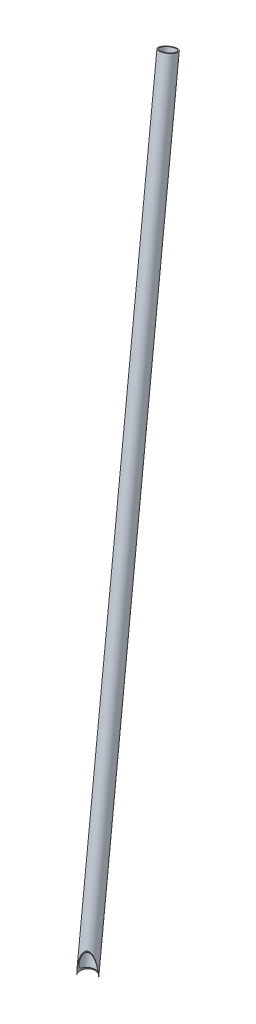
ISO-10303-21;
HEADER;
FILE_DESCRIPTION(('STEP AP214'),'2;1');
FILE_NAME('part.step','',(''),(''),'','','');
FILE_SCHEMA(('AUTOMOTIVE_DESIGN { 1 0 10303 214 1 1 1 1 }'));
ENDSEC;
DATA;
#1=APPLICATION_CONTEXT('core data for automotive mechanical design processes');
#2=APPLICATION_PROTOCOL_DEFINITION('international standard','automotive_design',2000,#1);
#3=PRODUCT_CONTEXT('',#1,'mechanical');
#4=PRODUCT('Part','Part','',(#3));
#5=PRODUCT_RELATED_PRODUCT_CATEGORY('part','',(#4));
#6=PRODUCT_DEFINITION_FORMATION('','',#4);
#7=PRODUCT_DEFINITION_CONTEXT('part definition',#1,'design');
#8=PRODUCT_DEFINITION('design','',#6,#7);
#9=PRODUCT_DEFINITION_SHAPE('','',#8);
#10=(LENGTH_UNIT() NAMED_UNIT(*) SI_UNIT(.MILLI.,.METRE.));
#11=(NAMED_UNIT(*) PLANE_ANGLE_UNIT() SI_UNIT($,.RADIAN.));
#12=(NAMED_UNIT(*) SI_UNIT($,.STERADIAN.) SOLID_ANGLE_UNIT());
#13=UNCERTAINTY_MEASURE_WITH_UNIT(LENGTH_MEASURE(1.E-05),#10,'distance_accuracy_value','');
#14=(GEOMETRIC_REPRESENTATION_CONTEXT(3) GLOBAL_UNCERTAINTY_ASSIGNED_CONTEXT((#13)) GLOBAL_UNIT_ASSIGNED_CONTEXT((#10,
#11,#12)) REPRESENTATION_CONTEXT('',''));
#15=CARTESIAN_POINT('',(0.,0.,0.));
#16=DIRECTION('',(0.,0.,1.));
#17=DIRECTION('',(1.,0.,0.));
#18=AXIS2_PLACEMENT_3D('',#15,#16,#17);
#19=CARTESIAN_POINT('',(250.,1.11022302462516E-13,-1700.));
#20=DIRECTION('',(-0.140336447675245,0.956366902675742,-0.256257739239816));
#21=DIRECTION('',(0.,0.258819045102517,0.965925826289069));
#22=AXIS2_PLACEMENT_3D('',#19,#20,#21);
#23=CYLINDRICAL_SURFACE('',#22,9.39999999999998);
#24=CARTESIAN_POINT('',(115.,920.,-1946.51325703663));
#25=DIRECTION('',(-0.140336447675245,0.956366902675742,-0.256257739239816));
#26=DIRECTION('',(0.,0.258819045102518,0.965925826289069));
#27=AXIS2_PLACEMENT_3D('',#24,#25,#26);
#28=CIRCLE('',#27,9.39999999999998);
#29=CARTESIAN_POINT('',(115.,922.432899023964,-1937.43355426951));
#30=VERTEX_POINT('',#29);
#31=EDGE_CURVE('E87',#30,#30,#28,.T.);
#32=ORIENTED_EDGE('',*,*,#31,.T.);
#33=EDGE_LOOP('',(#32));
#34=FACE_BOUND('',#33,.T.);
#35=CARTESIAN_POINT('',(246.53412812504,26.0521740236879,-1697.24906289487));
#36=CARTESIAN_POINT('',(246.379807682803,25.8125539413303,-1697.1848546284));
#37=CARTESIAN_POINT('',(246.231525016557,25.5678586593425,-1697.12508230074));
#38=CARTESIAN_POINT('',(245.945376662087,25.0706830951999,-1697.01328139346));
#39=CARTESIAN_POINT('',(245.807514651637,24.8182001083796,-1696.9612555416));
#40=CARTESIAN_POINT('',(245.54073759205,24.3068480241631,-1696.86404245289));
#41=CARTESIAN_POINT('',(245.411834695088,24.047970874425,-1696.81886441007));
#42=CARTESIAN_POINT('',(245.162087766815,23.5254178319802,-1696.73476956981));
#43=CARTESIAN_POINT('',(245.041242813524,23.2617424926865,-1696.69585205534));
#44=CARTESIAN_POINT('',(244.806093553511,22.7291516956389,-1696.62358516684));
#45=CARTESIAN_POINT('',(244.691824949501,22.4602166364508,-1696.59026458981));
#46=CARTESIAN_POINT('',(244.46970602688,21.9191016442582,-1696.52904512632));
#47=CARTESIAN_POINT('',(244.361855858057,21.6469216357037,-1696.50114636635));
#48=CARTESIAN_POINT('',(244.151993945148,21.1000808544526,-1696.45051534842));
#49=CARTESIAN_POINT('',(244.049977988814,20.8254220416464,-1696.42777932686));
#50=CARTESIAN_POINT('',(243.851131187338,20.2738685476695,-1696.38726794514));
#51=CARTESIAN_POINT('',(243.754300480959,19.9969738068916,-1696.36949271768));
#52=CARTESIAN_POINT('',(243.549474955923,19.3947015019372,-1696.33623328149));
#53=CARTESIAN_POINT('',(243.442333220343,19.0689849475946,-1696.32163399002));
#54=CARTESIAN_POINT('',(243.233750266971,18.4155021146709,-1696.2990610684));
#55=CARTESIAN_POINT('',(243.132309166752,18.0877357939695,-1696.29108757485));
#56=CARTESIAN_POINT('',(242.934462908879,17.4304308655111,-1696.28191428877));
#57=CARTESIAN_POINT('',(242.838060070807,17.100891517143,-1696.28071758947));
#58=CARTESIAN_POINT('',(242.649769464139,16.4405815053196,-1696.28542939377));
#59=CARTESIAN_POINT('',(242.557881627264,16.1098108605668,-1696.29133778988));
#60=CARTESIAN_POINT('',(242.378348429435,15.4484076264588,-1696.3107596678));
#61=CARTESIAN_POINT('',(242.290691157571,15.1177776051158,-1696.3242502595));
#62=CARTESIAN_POINT('',(242.118805786829,14.4560753447015,-1696.3595979745));
#63=CARTESIAN_POINT('',(242.034577613055,14.1250031154516,-1696.38145491497));
#64=CARTESIAN_POINT('',(241.869074279067,13.4630596690088,-1696.43463069429));
#65=CARTESIAN_POINT('',(241.78779756524,13.1321884389211,-1696.46594447186));
#66=CARTESIAN_POINT('',(241.627637844747,12.4711138431131,-1696.53958167101));
#67=CARTESIAN_POINT('',(241.548754537736,12.1409103984879,-1696.58190370475));
#68=CARTESIAN_POINT('',(241.401965220121,11.5204887660693,-1696.67401016029));
#69=CARTESIAN_POINT('',(241.333853453977,11.2301062499298,-1696.7223450312));
#70=CARTESIAN_POINT('',(241.198748748095,10.6513196559622,-1696.83133248151));
#71=CARTESIAN_POINT('',(241.131755955338,10.3629158409282,-1696.89198666553));
#72=CARTESIAN_POINT('',(240.998661250995,9.78944963307462,-1697.02828494601));
#73=CARTESIAN_POINT('',(240.932559243968,9.50438688271571,-1697.10392742272));
#74=CARTESIAN_POINT('',(240.801198869558,8.93959833816041,-1697.27369353144));
#75=CARTESIAN_POINT('',(240.735940207507,8.65987066267382,-1697.3678105115));
#76=CARTESIAN_POINT('',(240.626873763325,8.19493459341854,-1697.54590148397));
#77=CARTESIAN_POINT('',(240.582735250638,8.0075050548576,-1697.62385467003));
#78=CARTESIAN_POINT('',(240.495415930293,7.63807520891587,-1697.79213512227));
#79=CARTESIAN_POINT('',(240.45223480302,7.45607308241583,-1697.88245818433));
#80=CARTESIAN_POINT('',(240.367536512482,7.0996451375397,-1698.07682170816));
#81=CARTESIAN_POINT('',(240.326015773274,6.92520296105035,-1698.18083036135));
#82=CARTESIAN_POINT('',(240.245515221504,6.58562803393112,-1698.40396937496));
#83=CARTESIAN_POINT('',(240.206534713116,6.42049273563203,-1698.52309556777));
#84=CARTESIAN_POINT('',(240.138743244185,6.12878339024048,-1698.75555929326));
#85=CARTESIAN_POINT('',(240.109327600899,6.00041264104434,-1698.86646532298));
#86=CARTESIAN_POINT('',(240.054141606751,5.75288413970358,-1699.09893737765));
#87=CARTESIAN_POINT('',(240.02837052488,5.63372454220847,-1699.22050125694));
#88=CARTESIAN_POINT('',(239.981491500833,5.40552859917095,-1699.473617001));
#89=CARTESIAN_POINT('',(239.960383412624,5.29649193666425,-1699.60516855281));
#90=CARTESIAN_POINT('',(239.923827562665,5.08902134646749,-1699.87712419214));
#91=CARTESIAN_POINT('',(239.908380102146,4.99058798322878,-1700.01752875031));
#92=CARTESIAN_POINT('',(239.884077975094,4.80469354734486,-1700.3051734532));
#93=CARTESIAN_POINT('',(239.875198109836,4.71719161872321,-1700.4523851442));
#94=CARTESIAN_POINT('',(239.864638290821,4.55229470327107,-1700.75258882157));
#95=CARTESIAN_POINT('',(239.862958323632,4.47489969758671,-1700.90558079716));
#96=CARTESIAN_POINT('',(239.8673265176,4.32938764535375,-1701.21604815008));
#97=CARTESIAN_POINT('',(239.873385444651,4.26128366993179,-1701.37352947453));
#98=CARTESIAN_POINT('',(239.893611582026,4.13357770653366,-1701.69140407893));
#99=CARTESIAN_POINT('',(239.907780648518,4.07397766875632,-1701.85179801735));
#100=CARTESIAN_POINT('',(239.951907826961,3.93970979224118,-1702.23962921469));
#101=CARTESIAN_POINT('',(239.985937814391,3.86872613722964,-1702.46789004971));
#102=CARTESIAN_POINT('',(240.070817103638,3.73919213146803,-1702.92482851766));
#103=CARTESIAN_POINT('',(240.121672013062,3.68064593671865,-1703.15350626423));
#104=CARTESIAN_POINT('',(240.240290454365,3.57377520985178,-1703.60904295833));
#105=CARTESIAN_POINT('',(240.308067385348,3.52545883414947,-1703.83590031681));
#106=CARTESIAN_POINT('',(240.460365134032,3.43729722776971,-1704.28556452155));
#107=CARTESIAN_POINT('',(240.54488446353,3.39745124482566,-1704.50837172589));
#108=CARTESIAN_POINT('',(240.731666760942,3.32426074811312,-1704.95120900314));
#109=CARTESIAN_POINT('',(240.834157251516,3.29101292998598,-1705.17115903884));
#110=CARTESIAN_POINT('',(241.055645234333,3.23050221888124,-1705.60343770347));
#111=CARTESIAN_POINT('',(241.174642924014,3.20323939749889,-1705.81576624119));
#112=CARTESIAN_POINT('',(241.428568075861,3.15376015768939,-1706.23120972268));
#113=CARTESIAN_POINT('',(241.563491143679,3.13154235209682,-1706.43432718678));
#114=CARTESIAN_POINT('',(241.848626681709,3.09141378149293,-1706.82998239573));
#115=CARTESIAN_POINT('',(241.998839484807,3.07350311028427,-1707.02251991009));
#116=CARTESIAN_POINT('',(242.326552895837,3.04013263219194,-1707.41082810898));
#117=CARTESIAN_POINT('',(242.50527860827,3.02498947458217,-1707.60559421565));
#118=CARTESIAN_POINT('',(242.878533057708,2.99858144241503,-1707.97964742408));
#119=CARTESIAN_POINT('',(243.073062671061,2.9873167831076,-1708.15893366632));
#120=CARTESIAN_POINT('',(243.476639617233,2.96832961750598,-1708.50064019648));
#121=CARTESIAN_POINT('',(243.685689731826,2.9606077920992,-1708.66305723772));
#122=CARTESIAN_POINT('',(244.116799557896,2.9485247350971,-1708.96972776622));
#123=CARTESIAN_POINT('',(244.338858998923,2.94416343366664,-1709.11398163088));
#124=CARTESIAN_POINT('',(244.792494280886,2.93877806582687,-1709.38213468052));
#125=CARTESIAN_POINT('',(245.023975776615,2.93772658563161,-1709.50619295521));
#126=CARTESIAN_POINT('',(245.496487236634,2.93897053975508,-1709.73453006732));
#127=CARTESIAN_POINT('',(245.73751718334,2.94126596791067,-1709.83880894115));
#128=CARTESIAN_POINT('',(246.227326657256,2.94942417362468,-1710.02690628627));
#129=CARTESIAN_POINT('',(246.476104906968,2.95528636603773,-1710.11072811048));
#130=CARTESIAN_POINT('',(246.979628095732,2.97094352009083,-1710.2574719385));
#131=CARTESIAN_POINT('',(247.234373041124,2.98073848590838,-1710.32039392011));
#132=CARTESIAN_POINT('',(247.747739693254,3.00478058609817,-1710.42503588742));
#133=CARTESIAN_POINT('',(248.00635782137,3.01902382619739,-1710.46677433482));
#134=CARTESIAN_POINT('',(248.525798996673,3.05268648290769,-1710.52908144495));
#135=CARTESIAN_POINT('',(248.78662206373,3.07210594621342,-1710.54964991671));
#136=CARTESIAN_POINT('',(249.308790707394,3.11709650091633,-1710.56978038285));
#137=CARTESIAN_POINT('',(249.570136543826,3.1426732179402,-1710.56932309386));
#138=CARTESIAN_POINT('',(250.091141141166,3.20121651307673,-1710.54772328235));
#139=CARTESIAN_POINT('',(250.350799922915,3.23418299972259,-1710.52658101585));
#140=CARTESIAN_POINT('',(250.869331528294,3.3095414646983,-1710.46386061232));
#141=CARTESIAN_POINT('',(251.128161715568,3.35203652025598,-1710.42205245887));
#142=CARTESIAN_POINT('',(251.639800177365,3.44836485930948,-1710.31880789395));
#143=CARTESIAN_POINT('',(251.892607446191,3.5022000217915,-1710.25736822879));
#144=CARTESIAN_POINT('',(252.389237567101,3.62376195298031,-1710.11631078187));
#145=CARTESIAN_POINT('',(252.633074184131,3.69146629352549,-1710.03672232569));
#146=CARTESIAN_POINT('',(253.109223695722,3.84398468027493,-1709.86123107924));
#147=CARTESIAN_POINT('',(253.341542763451,3.928789434748,-1709.76533715316));
#148=CARTESIAN_POINT('',(253.718453931643,4.08817305249707,-1709.59327394083));
#149=CARTESIAN_POINT('',(253.867098796192,4.1571748604286,-1709.52076884531));
#150=CARTESIAN_POINT('',(254.156402913522,4.30561068188555,-1709.37072117423));
#151=CARTESIAN_POINT('',(254.297064610202,4.38504147782692,-1709.29318015609));
#152=CARTESIAN_POINT('',(254.5689489954,4.55500646238959,-1709.13457085783));
#153=CARTESIAN_POINT('',(254.70018985261,4.64551831515924,-1709.05350987902));
#154=CARTESIAN_POINT('',(254.952397012049,4.8382275309542,-1708.88928059742));
#155=CARTESIAN_POINT('',(255.073363361078,4.94042484074739,-1708.80611230423));
#156=CARTESIAN_POINT('',(255.304545387301,5.15686313592059,-1708.63899846939));
#157=CARTESIAN_POINT('',(255.414717478443,5.27114936264204,-1708.55505116348));
#158=CARTESIAN_POINT('',(255.623229378796,5.51078689077465,-1708.38829191745));
#159=CARTESIAN_POINT('',(255.721569430519,5.63613796530723,-1708.30547995409));
#160=CARTESIAN_POINT('',(255.906438528181,5.8968612095349,-1708.1422483968));
#161=CARTESIAN_POINT('',(255.992959033903,6.03224051734382,-1708.06183056522));
#162=CARTESIAN_POINT('',(256.154560940059,6.31153290389447,-1707.90434783231));
#163=CARTESIAN_POINT('',(256.229638356483,6.45544893065357,-1707.8272841054));
#164=CARTESIAN_POINT('',(256.398985764758,6.81341508211796,-1707.64487647481));
#165=CARTESIAN_POINT('',(256.487714396161,7.03111618958461,-1707.54154783948));
#166=CARTESIAN_POINT('',(256.646370095332,7.47683260992203,-1707.34307271946));
#167=CARTESIAN_POINT('',(256.716286146812,7.70485387518791,-1707.24793105099));
#168=CARTESIAN_POINT('',(256.840568487735,8.16895808375575,-1707.06482609144));
#169=CARTESIAN_POINT('',(256.894870512159,8.40506999135209,-1706.97689350323));
#170=CARTESIAN_POINT('',(256.990200195059,8.88214635037867,-1706.80761972693));
#171=CARTESIAN_POINT('',(257.031230747572,9.12310973168379,-1706.7262771047));
#172=CARTESIAN_POINT('',(257.120609694452,9.73384650842182,-1706.52836132687));
#173=CARTESIAN_POINT('',(257.161772856207,10.1058025356203,-1706.41531811983));
#174=CARTESIAN_POINT('',(257.224268811217,10.8540377995298,-1706.19815620743));
#175=CARTESIAN_POINT('',(257.245590011839,11.2303194336794,-1706.09404275146));
#176=CARTESIAN_POINT('',(257.272028091109,11.9858304448184,-1705.89175883858));
#177=CARTESIAN_POINT('',(257.277111491991,12.3650642979168,-1705.79360106855));
#178=CARTESIAN_POINT('',(257.273370327311,13.1243489597277,-1705.60126866919));
#179=CARTESIAN_POINT('',(257.264548832856,13.5043995695342,-1705.50709316502));
#180=CARTESIAN_POINT('',(257.234454515234,14.2660993273874,-1705.32058443496));
#181=CARTESIAN_POINT('',(257.213130800776,14.6477486421223,-1705.22826034319));
#182=CARTESIAN_POINT('',(257.158905924765,15.4104383483137,-1705.04443901442));
#183=CARTESIAN_POINT('',(257.126004108635,15.7914787041183,-1704.95294182447));
#184=CARTESIAN_POINT('',(257.049134541565,16.5518685370512,-1704.76972116769));
#185=CARTESIAN_POINT('',(257.005180931705,16.9312195492344,-1704.67799813723));
#186=CARTESIAN_POINT('',(256.906288940777,17.6881316961282,-1704.49319518097));
#187=CARTESIAN_POINT('',(256.851351124191,18.0656929217962,-1704.40011532514));
#188=CARTESIAN_POINT('',(256.706267435566,18.9678727556923,-1704.17424357824));
#189=CARTESIAN_POINT('',(256.610802260409,19.4913733505817,-1704.04035460837));
#190=CARTESIAN_POINT('',(256.396501304596,20.5320279165607,-1703.76552538615));
#191=CARTESIAN_POINT('',(256.277655695421,21.0491791210665,-1703.62458218704));
#192=CARTESIAN_POINT('',(256.080090986054,21.8164153516393,-1703.40629322308));
#193=CARTESIAN_POINT('',(256.011225251006,22.0700927635153,-1703.33258634099));
#194=CARTESIAN_POINT('',(255.866498127363,22.5746067382574,-1703.18239601797));
#195=CARTESIAN_POINT('',(255.790637253822,22.825443508756,-1703.10591278171));
#196=CARTESIAN_POINT('',(255.631345693294,23.3235563364871,-1702.94979058234));
#197=CARTESIAN_POINT('',(255.547919075326,23.5708342258104,-1702.87015332835));
#198=CARTESIAN_POINT('',(255.372702518492,24.0611638469078,-1702.70721727027));
#199=CARTESIAN_POINT('',(255.280913794991,24.3042161867369,-1702.62391899918));
#200=CARTESIAN_POINT('',(255.107487547608,24.7365320216257,-1702.47035040469));
#201=CARTESIAN_POINT('',(255.02754323091,24.9267459893822,-1702.40084611512));
#202=CARTESIAN_POINT('',(254.861117115752,25.3031616232892,-1702.25882371454));
#203=CARTESIAN_POINT('',(254.774635354293,25.4893633121403,-1702.1863056206));
#204=CARTESIAN_POINT('',(254.594163727944,25.8574190613002,-1702.03766968802));
#205=CARTESIAN_POINT('',(254.500152314175,26.0392585568138,-1701.96154179209));
#206=CARTESIAN_POINT('',(254.304006655449,26.3968385524254,-1701.80547225327));
#207=CARTESIAN_POINT('',(254.201872730009,26.5725792920406,-1701.72553076045));
#208=CARTESIAN_POINT('',(253.987194953268,26.9184930603239,-1701.56037269785));
#209=CARTESIAN_POINT('',(253.874539973108,27.0885728382581,-1701.47510395247));
#210=CARTESIAN_POINT('',(253.638666587012,27.4187589297455,-1701.29963723256));
#211=CARTESIAN_POINT('',(253.515444321748,27.5788615623221,-1701.20943746155));
#212=CARTESIAN_POINT('',(253.257707049548,27.8853862538313,-1701.02402091641));
#213=CARTESIAN_POINT('',(253.123239651409,28.0318609438831,-1700.92882587147));
#214=CARTESIAN_POINT('',(252.84152061213,28.3076091593224,-1700.732851016));
#215=CARTESIAN_POINT('',(252.694283965202,28.4369024197837,-1700.6320778046));
#216=CARTESIAN_POINT('',(252.382532458023,28.6758334058775,-1700.4224864567));
#217=CARTESIAN_POINT('',(252.217694182155,28.7849410731098,-1700.31353533607));
#218=CARTESIAN_POINT('',(251.874129227829,28.9723860211653,-1700.09069947943));
#219=CARTESIAN_POINT('',(251.695415953329,29.0507525671027,-1699.97681955084));
#220=CARTESIAN_POINT('',(251.418407245095,29.1400993781772,-1699.80366558921));
#221=CARTESIAN_POINT('',(251.324035453226,29.1652402742282,-1699.7452296813));
#222=CARTESIAN_POINT('',(251.133228108937,29.2051331488466,-1699.62821951292));
#223=CARTESIAN_POINT('',(251.036793554313,29.2198900382694,-1699.56964533102));
#224=CARTESIAN_POINT('',(250.842675244479,29.2385527770658,-1699.45288530436));
#225=CARTESIAN_POINT('',(250.744991835383,29.242461570138,-1699.39469935854));
#226=CARTESIAN_POINT('',(250.54928594185,29.2393582691243,-1699.27926085677));
#227=CARTESIAN_POINT('',(250.451263477495,29.2323468111174,-1699.22200824667));
#228=CARTESIAN_POINT('',(250.179093819975,29.1979004417651,-1699.06459783388));
#229=CARTESIAN_POINT('',(250.005440839995,29.1587722016189,-1698.96594825383));
#230=CARTESIAN_POINT('',(249.664198039796,29.0502699197859,-1698.77540797788));
#231=CARTESIAN_POINT('',(249.496613061766,28.9808722755224,-1698.68352262187));
#232=CARTESIAN_POINT('',(249.089257064245,28.776770487236,-1698.46394309587));
#233=CARTESIAN_POINT('',(248.854631548249,28.6267373292747,-1698.34092892002));
#234=CARTESIAN_POINT('',(248.518721530915,28.3727936753268,-1698.16911576693));
#235=CARTESIAN_POINT('',(248.409249095163,28.2831515563465,-1698.11387902399));
#236=CARTESIAN_POINT('',(248.195406710846,28.0957812667208,-1698.00735588769));
#237=CARTESIAN_POINT('',(248.091035640336,27.9980548868947,-1697.95606862427));
#238=CARTESIAN_POINT('',(247.852291278468,27.7613224866129,-1697.8402638752));
#239=CARTESIAN_POINT('',(247.719874150835,27.6196350222512,-1697.77722530843));
#240=CARTESIAN_POINT('',(247.463051173541,27.3267959436224,-1697.65710006713));
#241=CARTESIAN_POINT('',(247.338647605522,27.1756416578882,-1697.60001508488));
#242=CARTESIAN_POINT('',(247.097125848439,26.86585624897,-1697.49119441219));
#243=CARTESIAN_POINT('',(246.980006538152,26.7072262831139,-1697.43945789767));
#244=CARTESIAN_POINT('',(246.752322293508,26.3839447454106,-1697.34078293568));
#245=CARTESIAN_POINT('',(246.641756770541,26.2192937164835,-1697.29384405703));
#246=CARTESIAN_POINT('',(246.53412812504,26.0521740236879,-1697.24906289487));
#247=B_SPLINE_CURVE_WITH_KNOTS('',3,(#35,#36,#37,#38,#39,#40,#41,#42,#43,#44,#45,#46,#47,#48,
#49,#50,#51,#52,#53,#54,#55,#56,#57,#58,#59,#60,#61,#62,#63,#64,#65,#66,#67,#68,#69,#70,#71,#72,
#73,#74,#75,#76,#77,#78,#79,#80,#81,#82,#83,#84,#85,#86,#87,#88,#89,#90,#91,#92,#93,#94,#95,#96,
#97,#98,#99,#100,#101,#102,#103,#104,#105,#106,#107,#108,#109,#110,#111,#112,#113,#114,#115,
#116,#117,#118,#119,#120,#121,#122,#123,#124,#125,#126,#127,#128,#129,#130,#131,#132,#133,#134,
#135,#136,#137,#138,#139,#140,#141,#142,#143,#144,#145,#146,#147,#148,#149,#150,#151,#152,#153,
#154,#155,#156,#157,#158,#159,#160,#161,#162,#163,#164,#165,#166,#167,#168,#169,#170,#171,#172,
#173,#174,#175,#176,#177,#178,#179,#180,#181,#182,#183,#184,#185,#186,#187,#188,#189,#190,#191,
#192,#193,#194,#195,#196,#197,#198,#199,#200,#201,#202,#203,#204,#205,#206,#207,#208,#209,#210,
#211,#212,#213,#214,#215,#216,#217,#218,#219,#220,#221,#222,#223,#224,#225,#226,#227,#228,#229,
#230,#231,#232,#233,#234,#235,#236,#237,#238,#239,#240,#241,#242,#243,#244,#245,#246),
.UNSPECIFIED.,.T.,.F.,(4,2,2,2,2,2,2,2,2,2,2,2,2,2,2,2,2,2,2,2,2,2,2,2,2,2,2,2,2,2,2,2,2,2,2,2,
2,2,2,2,2,2,2,2,2,2,2,2,2,2,2,2,2,2,2,2,2,2,2,2,2,2,2,2,2,2,2,2,2,2,2,2,2,2,2,2,2,2,2,2,2,2,2,2,
2,2,2,2,2,2,2,2,2,2,2,2,2,2,2,2,2,2,2,2,2,4),(0.,0.87638036167835,1.75306859498428,
2.6309236570293,3.50867810296069,4.39081886913835,5.27298021391707,6.15449638944564,
7.03603614322514,8.06549721021325,9.09497950135467,10.1249316576202,11.1548682331161,
12.1817120762943,13.2085334802939,14.2348063033921,15.2609498041491,16.167205641306,
17.0735795959988,17.9798556541204,18.8858059949958,19.5086584182,20.1312996768734,
20.7525185212304,21.3735664785352,21.8895237072035,22.4053773003102,22.9212147358158,
23.4370796176271,23.9509547989652,24.464829021685,24.9794188951969,25.4941265900258,
26.2174573754382,26.9410294843255,27.6651763553731,28.3892588871019,29.1232753487675,
29.8573005905927,30.5911237615532,31.3249629125916,32.1183276438821,32.9117363984441,
33.7052975722241,34.4988422545448,35.2857968250632,36.0727499464515,36.859573999075,
37.6463988874882,38.4325368663603,39.2186819372152,40.0055480205013,40.792404364898,
41.5882227934376,42.3841731880819,43.1788464528651,43.973089079584,44.5102141990368,
45.0471739906657,45.5830687333681,46.1189610349441,46.6569349993803,47.194897935519,
47.7332475439016,48.2717841573221,49.0408479072976,49.8103610311182,50.5829974480398,
51.3554652665812,52.5273328628409,53.6998846917949,54.8748524370079,56.0495607092816,
57.2290842542828,58.4086744953909,59.586763030707,60.7647910391171,62.410440215495,
64.0567826634312,64.8756787034575,65.6945144960465,66.5129124838027,67.3311917129859,
67.9842270877856,68.6372587669072,69.2922311321479,69.9471777453984,70.6100592955336,
71.2731839792624,71.9336309918861,72.5933127156058,73.2684136178496,73.9428702647272,
74.2838818940359,74.6247321418663,74.9654898888127,75.3062277881662,75.9137783510489,
76.5218035009411,77.4295972068814,77.8850580928793,78.340418354315,78.9516137083325,
79.5629823211392,80.1742565954392,80.7854758863053),.UNSPECIFIED.);
#248=CARTESIAN_POINT('',(246.53412812504,26.0521740236879,-1697.24906289487));
#249=VERTEX_POINT('',#248);
#250=EDGE_CURVE('E81',#249,#249,#247,.T.);
#251=ORIENTED_EDGE('',*,*,#250,.T.);
#252=EDGE_LOOP('',(#251));
#253=FACE_BOUND('',#252,.T.);
#254=ADVANCED_FACE('F41',(#34,#253),#23,.F.);
#255=CARTESIAN_POINT('',(115.,920.,-1946.51325703663));
#256=DIRECTION('',(-0.140336447675245,0.956366902675742,-0.256257739239816));
#257=DIRECTION('',(0.,0.258819045102518,0.965925826289069));
#258=AXIS2_PLACEMENT_3D('',#255,#256,#257);
#259=PLANE('',#258);
#260=ORIENTED_EDGE('',*,*,#31,.F.);
#261=EDGE_LOOP('',(#260));
#262=FACE_BOUND('',#261,.T.);
#263=CARTESIAN_POINT('',(115.,920.,-1946.51325703663));
#264=DIRECTION('',(-0.140336447675245,0.956366902675742,-0.256257739239816));
#265=DIRECTION('',(0.,0.258819045102518,0.965925826289069));
#266=AXIS2_PLACEMENT_3D('',#263,#264,#265);
#267=CIRCLE('',#266,11.);
#268=CARTESIAN_POINT('',(115.,922.847009496128,-1935.88807294745));
#269=VERTEX_POINT('',#268);
#270=EDGE_CURVE('E57',#269,#269,#267,.T.);
#271=ORIENTED_EDGE('',*,*,#270,.T.);
#272=EDGE_LOOP('',(#271));
#273=FACE_BOUND('',#272,.T.);
#274=ADVANCED_FACE('F43',(#262,#273),#259,.T.);
#275=CARTESIAN_POINT('',(250.,1.11022302462516E-13,-1700.));
#276=DIRECTION('',(-0.140336447675245,0.956366902675742,-0.256257739239816));
#277=DIRECTION('',(0.,0.258819045102517,0.965925826289069));
#278=AXIS2_PLACEMENT_3D('',#275,#276,#277);
#279=CYLINDRICAL_SURFACE('',#278,11.);
#280=ORIENTED_EDGE('',*,*,#270,.F.);
#281=EDGE_LOOP('',(#280));
#282=FACE_BOUND('',#281,.T.);
#283=CARTESIAN_POINT('',(250.,8.16716449652246E-13,-1700.));
#284=DIRECTION('',(-0.508456010272344,0.0599232902931692,-0.859000398660194));
#285=DIRECTION('',(0.0394871934442316,0.998148808069163,0.0462570913915509));
#286=AXIS2_PLACEMENT_3D('',#283,#284,#285);
#287=ELLIPSE('',#286,31.5376862377806,11.);
#288=CARTESIAN_POINT('',(259.462003112861,-0.114398006522159,-1705.60869059481));
#289=VERTEX_POINT('',#288);
#290=CARTESIAN_POINT('',(240.537996887139,0.114398006523792,-1694.39130940519));
#291=VERTEX_POINT('',#290);
#292=EDGE_CURVE('E11',#289,#291,#287,.F.);
#293=ORIENTED_EDGE('',*,*,#292,.F.);
#294=CARTESIAN_POINT('',(250.,8.16716449652246E-13,-1700.));
#295=DIRECTION('',(0.0394871934442316,0.998148808069163,0.0462570913915509));
#296=DIRECTION('',(-0.508456010272344,0.0599232902931692,-0.859000398660194));
#297=AXIS2_PLACEMENT_3D('',#294,#295,#296);
#298=ELLIPSE('',#297,11.7370734990693,11.);
#299=EDGE_CURVE('E49',#291,#289,#298,.F.);
#300=ORIENTED_EDGE('',*,*,#299,.F.);
#301=EDGE_LOOP('',(#293,#300));
#302=FACE_BOUND('',#301,.T.);
#303=ADVANCED_FACE('F58',(#282,#302),#279,.T.);
#304=CARTESIAN_POINT('',(325.,320.,-1580.));
#305=DIRECTION('',(-0.214351342090107,-0.914565726251124,-0.342962147344171));
#306=DIRECTION('',(0.,0.351123441588391,-0.936329177569045));
#307=AXIS2_PLACEMENT_3D('',#304,#305,#306);
#308=CYLINDRICAL_SURFACE('',#307,11.);
#309=ORIENTED_EDGE('',*,*,#250,.F.);
#310=EDGE_LOOP('',(#309));
#311=FACE_BOUND('',#310,.T.);
#312=ORIENTED_EDGE('',*,*,#292,.T.);
#313=ORIENTED_EDGE('',*,*,#299,.T.);
#314=EDGE_LOOP('',(#312,#313));
#315=FACE_BOUND('',#314,.T.);
#316=ADVANCED_FACE('F55',(#311,#315),#308,.F.);
#317=CLOSED_SHELL('',(#254,#274,#303,#316));
#318=MANIFOLD_SOLID_BREP('B2',#317);
#319=ADVANCED_BREP_SHAPE_REPRESENTATION('',(#18,#318),#14);
#320=SHAPE_DEFINITION_REPRESENTATION(#9,#319);
ENDSEC;
END-ISO-10303-21;
